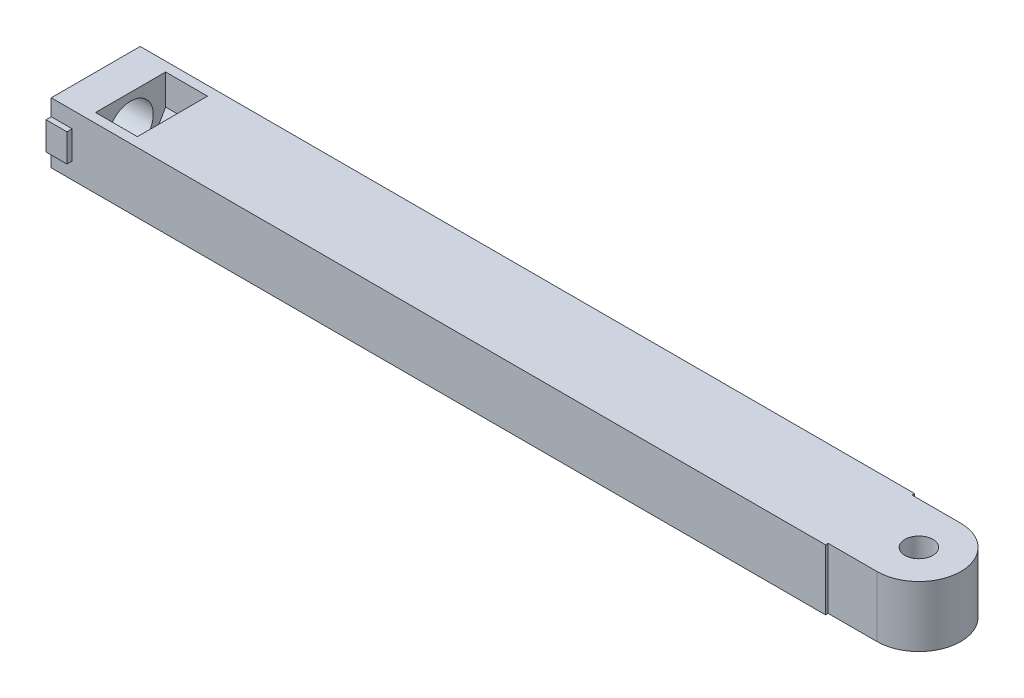
ISO-10303-21;
HEADER;
FILE_DESCRIPTION(('STEP AP214'),'2;1');
FILE_NAME('part.step','',(''),(''),'','','');
FILE_SCHEMA(('AUTOMOTIVE_DESIGN { 1 0 10303 214 1 1 1 1 }'));
ENDSEC;
DATA;
#1=APPLICATION_CONTEXT('core data for automotive mechanical design processes');
#2=APPLICATION_PROTOCOL_DEFINITION('international standard','automotive_design',2000,#1);
#3=PRODUCT_CONTEXT('',#1,'mechanical');
#4=PRODUCT('Part','Part','',(#3));
#5=PRODUCT_RELATED_PRODUCT_CATEGORY('part','',(#4));
#6=PRODUCT_DEFINITION_FORMATION('','',#4);
#7=PRODUCT_DEFINITION_CONTEXT('part definition',#1,'design');
#8=PRODUCT_DEFINITION('design','',#6,#7);
#9=PRODUCT_DEFINITION_SHAPE('','',#8);
#10=(LENGTH_UNIT() NAMED_UNIT(*) SI_UNIT(.MILLI.,.METRE.));
#11=(NAMED_UNIT(*) PLANE_ANGLE_UNIT() SI_UNIT($,.RADIAN.));
#12=(NAMED_UNIT(*) SI_UNIT($,.STERADIAN.) SOLID_ANGLE_UNIT());
#13=UNCERTAINTY_MEASURE_WITH_UNIT(LENGTH_MEASURE(1.E-05),#10,'distance_accuracy_value','');
#14=(GEOMETRIC_REPRESENTATION_CONTEXT(3) GLOBAL_UNCERTAINTY_ASSIGNED_CONTEXT((#13)) GLOBAL_UNIT_ASSIGNED_CONTEXT((#10,
#11,#12)) REPRESENTATION_CONTEXT('',''));
#15=CARTESIAN_POINT('',(0.,0.,0.));
#16=DIRECTION('',(0.,0.,1.));
#17=DIRECTION('',(1.,0.,0.));
#18=AXIS2_PLACEMENT_3D('',#15,#16,#17);
#19=CARTESIAN_POINT('',(-118.,-4.35,6.37500000000001));
#20=DIRECTION('',(0.,0.,-1.));
#21=DIRECTION('',(-1.,0.,0.));
#22=AXIS2_PLACEMENT_3D('',#19,#20,#21);
#23=PLANE('',#22);
#24=DIRECTION('',(-1.,0.,0.));
#25=VECTOR('',#24,1.);
#26=CARTESIAN_POINT('',(-115.,2.,6.37500000000002));
#27=LINE('',#26,#25);
#28=CARTESIAN_POINT('',(-115.,2.,6.37500000000002));
#29=VERTEX_POINT('',#28);
#30=CARTESIAN_POINT('',(-118.,2.,6.37500000000002));
#31=VERTEX_POINT('',#30);
#32=EDGE_CURVE('E203',#29,#31,#27,.T.);
#33=ORIENTED_EDGE('',*,*,#32,.F.);
#34=DIRECTION('',(0.,-1.,0.));
#35=VECTOR('',#34,1.);
#36=CARTESIAN_POINT('',(-115.,2.,6.37500000000002));
#37=LINE('',#36,#35);
#38=CARTESIAN_POINT('',(-115.,-2.,6.37500000000002));
#39=VERTEX_POINT('',#38);
#40=EDGE_CURVE('E196',#29,#39,#37,.T.);
#41=ORIENTED_EDGE('',*,*,#40,.T.);
#42=DIRECTION('',(-1.,0.,0.));
#43=VECTOR('',#42,1.);
#44=CARTESIAN_POINT('',(-115.,-2.,6.37500000000002));
#45=LINE('',#44,#43);
#46=CARTESIAN_POINT('',(-118.,-2.,6.37500000000001));
#47=VERTEX_POINT('',#46);
#48=EDGE_CURVE('E182',#39,#47,#45,.T.);
#49=ORIENTED_EDGE('',*,*,#48,.T.);
#50=DIRECTION('',(0.,1.,0.));
#51=VECTOR('',#50,1.);
#52=CARTESIAN_POINT('',(-118.,0.817855368675086,6.37500000000001));
#53=LINE('',#52,#51);
#54=CARTESIAN_POINT('',(-118.,-4.35,6.37500000000001));
#55=VERTEX_POINT('',#54);
#56=EDGE_CURVE('E291',#55,#47,#53,.T.);
#57=ORIENTED_EDGE('',*,*,#56,.F.);
#58=DIRECTION('',(1.,0.,0.));
#59=VECTOR('',#58,1.);
#60=CARTESIAN_POINT('',(-118.,-4.35,6.37500000000001));
#61=LINE('',#60,#59);
#62=CARTESIAN_POINT('',(-7.,-4.35,6.375));
#63=VERTEX_POINT('',#62);
#64=EDGE_CURVE('E303',#55,#63,#61,.T.);
#65=ORIENTED_EDGE('',*,*,#64,.T.);
#66=DIRECTION('',(0.,1.,0.));
#67=VECTOR('',#66,1.);
#68=CARTESIAN_POINT('',(-7.,-4.35,6.375));
#69=LINE('',#68,#67);
#70=CARTESIAN_POINT('',(-7.,4.35,6.375));
#71=VERTEX_POINT('',#70);
#72=EDGE_CURVE('E313',#63,#71,#69,.T.);
#73=ORIENTED_EDGE('',*,*,#72,.T.);
#74=DIRECTION('',(1.,0.,0.));
#75=VECTOR('',#74,1.);
#76=CARTESIAN_POINT('',(-118.,4.35,6.37500000000001));
#77=LINE('',#76,#75);
#78=CARTESIAN_POINT('',(-118.,4.35,6.37500000000001));
#79=VERTEX_POINT('',#78);
#80=EDGE_CURVE('E323',#79,#71,#77,.T.);
#81=ORIENTED_EDGE('',*,*,#80,.F.);
#82=EDGE_CURVE('E294',#31,#79,#53,.T.);
#83=ORIENTED_EDGE('',*,*,#82,.F.);
#84=EDGE_LOOP('',(#33,#41,#49,#57,#65,#73,#81,#83));
#85=FACE_BOUND('',#84,.T.);
#86=ADVANCED_FACE('F35',(#85),#23,.F.);
#87=CARTESIAN_POINT('',(-118.,-4.35,-6.37499999999999));
#88=DIRECTION('',(0.,0.,1.));
#89=DIRECTION('',(1.,0.,0.));
#90=AXIS2_PLACEMENT_3D('',#87,#88,#89);
#91=PLANE('',#90);
#92=DIRECTION('',(-1.,0.,0.));
#93=VECTOR('',#92,1.);
#94=CARTESIAN_POINT('',(-115.,-2.,-6.37499999999999));
#95=LINE('',#94,#93);
#96=CARTESIAN_POINT('',(-115.,-2.,-6.37499999999999));
#97=VERTEX_POINT('',#96);
#98=CARTESIAN_POINT('',(-118.,-2.,-6.37499999999999));
#99=VERTEX_POINT('',#98);
#100=EDGE_CURVE('E239',#97,#99,#95,.T.);
#101=ORIENTED_EDGE('',*,*,#100,.F.);
#102=DIRECTION('',(0.,1.,0.));
#103=VECTOR('',#102,1.);
#104=CARTESIAN_POINT('',(-115.,2.,-6.37499999999999));
#105=LINE('',#104,#103);
#106=CARTESIAN_POINT('',(-115.,2.,-6.37499999999999));
#107=VERTEX_POINT('',#106);
#108=EDGE_CURVE('E219',#97,#107,#105,.T.);
#109=ORIENTED_EDGE('',*,*,#108,.T.);
#110=DIRECTION('',(-1.,0.,0.));
#111=VECTOR('',#110,1.);
#112=CARTESIAN_POINT('',(-115.,2.,-6.37499999999999));
#113=LINE('',#112,#111);
#114=CARTESIAN_POINT('',(-118.,2.,-6.37499999999999));
#115=VERTEX_POINT('',#114);
#116=EDGE_CURVE('E232',#107,#115,#113,.T.);
#117=ORIENTED_EDGE('',*,*,#116,.T.);
#118=DIRECTION('',(0.,-1.,0.));
#119=VECTOR('',#118,1.);
#120=CARTESIAN_POINT('',(-118.,-0.75,-6.37499999999999));
#121=LINE('',#120,#119);
#122=CARTESIAN_POINT('',(-118.,4.35,-6.37499999999999));
#123=VERTEX_POINT('',#122);
#124=EDGE_CURVE('E297',#123,#115,#121,.T.);
#125=ORIENTED_EDGE('',*,*,#124,.F.);
#126=DIRECTION('',(1.,0.,0.));
#127=VECTOR('',#126,1.);
#128=CARTESIAN_POINT('',(-118.,4.35,-6.37499999999999));
#129=LINE('',#128,#127);
#130=CARTESIAN_POINT('',(-7.,4.35,-6.375));
#131=VERTEX_POINT('',#130);
#132=EDGE_CURVE('E320',#123,#131,#129,.T.);
#133=ORIENTED_EDGE('',*,*,#132,.T.);
#134=DIRECTION('',(0.,-1.,0.));
#135=VECTOR('',#134,1.);
#136=CARTESIAN_POINT('',(-7.,-4.35,-6.375));
#137=LINE('',#136,#135);
#138=CARTESIAN_POINT('',(-7.,-4.35,-6.375));
#139=VERTEX_POINT('',#138);
#140=EDGE_CURVE('E307',#131,#139,#137,.T.);
#141=ORIENTED_EDGE('',*,*,#140,.T.);
#142=DIRECTION('',(1.,0.,0.));
#143=VECTOR('',#142,1.);
#144=CARTESIAN_POINT('',(-118.,-4.35,-6.37499999999999));
#145=LINE('',#144,#143);
#146=CARTESIAN_POINT('',(-118.,-4.35,-6.37499999999999));
#147=VERTEX_POINT('',#146);
#148=EDGE_CURVE('E317',#147,#139,#145,.T.);
#149=ORIENTED_EDGE('',*,*,#148,.F.);
#150=EDGE_CURVE('E296',#99,#147,#121,.T.);
#151=ORIENTED_EDGE('',*,*,#150,.F.);
#152=EDGE_LOOP('',(#101,#109,#117,#125,#133,#141,#149,#151));
#153=FACE_BOUND('',#152,.T.);
#154=ADVANCED_FACE('F415',(#153),#91,.F.);
#155=CARTESIAN_POINT('',(-4.99999999999992,0.,0.));
#156=DIRECTION('',(-1.,0.,0.));
#157=DIRECTION('',(0.,0.,1.));
#158=AXIS2_PLACEMENT_3D('',#155,#156,#157);
#159=CYLINDRICAL_SURFACE('',#158,3.25);
#160=CARTESIAN_POINT('',(-118.,0.,0.));
#161=DIRECTION('',(-1.,0.,0.));
#162=DIRECTION('',(0.,0.,1.));
#163=AXIS2_PLACEMENT_3D('',#160,#161,#162);
#164=CIRCLE('',#163,3.25);
#165=CARTESIAN_POINT('',(-118.,0.,3.25000000000002));
#166=VERTEX_POINT('',#165);
#167=EDGE_CURVE('E284',#166,#166,#164,.T.);
#168=CARTESIAN_POINT('',(-113.,0.,0.));
#169=DIRECTION('',(1.,0.,0.));
#170=DIRECTION('',(0.,0.,-1.));
#171=AXIS2_PLACEMENT_3D('',#168,#169,#170);
#172=CIRCLE('',#171,3.25);
#173=CARTESIAN_POINT('',(-113.,0.,3.25000000000002));
#174=VERTEX_POINT('',#173);
#175=EDGE_CURVE('E270',#174,#174,#172,.F.);
#176=CARTESIAN_POINT('',(-118.,0.,3.25000000000002));
#177=CARTESIAN_POINT('',(-117.947916666667,0.,3.25000000000002));
#178=CARTESIAN_POINT('',(-117.895833333333,0.,3.25000000000002));
#179=CARTESIAN_POINT('',(-117.791666666667,0.,3.25000000000002));
#180=CARTESIAN_POINT('',(-117.739583333333,0.,3.25000000000002));
#181=CARTESIAN_POINT('',(-117.635416666667,0.,3.25000000000002));
#182=CARTESIAN_POINT('',(-117.583333333333,0.,3.25000000000002));
#183=CARTESIAN_POINT('',(-117.479166666667,0.,3.25000000000002));
#184=CARTESIAN_POINT('',(-117.427083333333,0.,3.25000000000002));
#185=CARTESIAN_POINT('',(-117.322916666667,0.,3.25000000000002));
#186=CARTESIAN_POINT('',(-117.270833333333,0.,3.25000000000002));
#187=CARTESIAN_POINT('',(-117.166666666667,0.,3.25000000000002));
#188=CARTESIAN_POINT('',(-117.114583333333,0.,3.25000000000002));
#189=CARTESIAN_POINT('',(-117.010416666667,0.,3.25000000000002));
#190=CARTESIAN_POINT('',(-116.958333333333,0.,3.25000000000002));
#191=CARTESIAN_POINT('',(-116.854166666667,0.,3.25000000000002));
#192=CARTESIAN_POINT('',(-116.802083333333,0.,3.25000000000002));
#193=CARTESIAN_POINT('',(-116.697916666667,0.,3.25000000000002));
#194=CARTESIAN_POINT('',(-116.645833333333,0.,3.25000000000002));
#195=CARTESIAN_POINT('',(-116.541666666667,0.,3.25000000000002));
#196=CARTESIAN_POINT('',(-116.489583333333,0.,3.25000000000002));
#197=CARTESIAN_POINT('',(-116.385416666667,0.,3.25000000000002));
#198=CARTESIAN_POINT('',(-116.333333333333,0.,3.25000000000002));
#199=CARTESIAN_POINT('',(-116.229166666667,0.,3.25000000000002));
#200=CARTESIAN_POINT('',(-116.177083333333,0.,3.25000000000002));
#201=CARTESIAN_POINT('',(-116.072916666667,0.,3.25000000000002));
#202=CARTESIAN_POINT('',(-116.020833333333,0.,3.25000000000002));
#203=CARTESIAN_POINT('',(-115.916666666667,0.,3.25000000000002));
#204=CARTESIAN_POINT('',(-115.864583333333,0.,3.25000000000002));
#205=CARTESIAN_POINT('',(-115.760416666667,0.,3.25000000000002));
#206=CARTESIAN_POINT('',(-115.708333333333,0.,3.25000000000002));
#207=CARTESIAN_POINT('',(-115.604166666667,0.,3.25000000000002));
#208=CARTESIAN_POINT('',(-115.552083333333,0.,3.25000000000002));
#209=CARTESIAN_POINT('',(-115.447916666667,0.,3.25000000000002));
#210=CARTESIAN_POINT('',(-115.395833333333,0.,3.25000000000002));
#211=CARTESIAN_POINT('',(-115.291666666667,0.,3.25000000000002));
#212=CARTESIAN_POINT('',(-115.239583333333,0.,3.25000000000002));
#213=CARTESIAN_POINT('',(-115.135416666667,0.,3.25000000000002));
#214=CARTESIAN_POINT('',(-115.083333333333,0.,3.25000000000002));
#215=CARTESIAN_POINT('',(-114.979166666667,0.,3.25000000000002));
#216=CARTESIAN_POINT('',(-114.927083333333,0.,3.25000000000002));
#217=CARTESIAN_POINT('',(-114.822916666667,0.,3.25000000000002));
#218=CARTESIAN_POINT('',(-114.770833333333,0.,3.25000000000002));
#219=CARTESIAN_POINT('',(-114.666666666667,0.,3.25000000000002));
#220=CARTESIAN_POINT('',(-114.614583333333,0.,3.25000000000002));
#221=CARTESIAN_POINT('',(-114.510416666667,0.,3.25000000000002));
#222=CARTESIAN_POINT('',(-114.458333333333,0.,3.25000000000002));
#223=CARTESIAN_POINT('',(-114.354166666667,0.,3.25000000000002));
#224=CARTESIAN_POINT('',(-114.302083333333,0.,3.25000000000002));
#225=CARTESIAN_POINT('',(-114.197916666667,0.,3.25000000000002));
#226=CARTESIAN_POINT('',(-114.145833333333,0.,3.25000000000002));
#227=CARTESIAN_POINT('',(-114.041666666667,0.,3.25000000000002));
#228=CARTESIAN_POINT('',(-113.989583333333,0.,3.25000000000002));
#229=CARTESIAN_POINT('',(-113.885416666667,0.,3.25000000000002));
#230=CARTESIAN_POINT('',(-113.833333333333,0.,3.25000000000002));
#231=CARTESIAN_POINT('',(-113.729166666667,0.,3.25000000000002));
#232=CARTESIAN_POINT('',(-113.677083333333,0.,3.25000000000002));
#233=CARTESIAN_POINT('',(-113.572916666667,0.,3.25000000000002));
#234=CARTESIAN_POINT('',(-113.520833333333,0.,3.25000000000002));
#235=CARTESIAN_POINT('',(-113.416666666667,0.,3.25000000000002));
#236=CARTESIAN_POINT('',(-113.364583333333,0.,3.25000000000002));
#237=CARTESIAN_POINT('',(-113.260416666667,0.,3.25000000000002));
#238=CARTESIAN_POINT('',(-113.208333333333,0.,3.25000000000002));
#239=CARTESIAN_POINT('',(-113.104166666667,0.,3.25000000000002));
#240=CARTESIAN_POINT('',(-113.052083333333,0.,3.25000000000002));
#241=CARTESIAN_POINT('',(-113.,0.,3.25000000000002));
#242=B_SPLINE_CURVE_WITH_KNOTS('',3,(#176,#177,#178,#179,#180,#181,#182,#183,#184,#185,#186,
#187,#188,#189,#190,#191,#192,#193,#194,#195,#196,#197,#198,#199,#200,#201,#202,#203,#204,#205,
#206,#207,#208,#209,#210,#211,#212,#213,#214,#215,#216,#217,#218,#219,#220,#221,#222,#223,#224,
#225,#226,#227,#228,#229,#230,#231,#232,#233,#234,#235,#236,#237,#238,#239,#240,#241),
.UNSPECIFIED.,.F.,.F.,(4,2,2,2,2,2,2,2,2,2,2,2,2,2,2,2,2,2,2,2,2,2,2,2,2,2,2,2,2,2,2,2,4),(0.,
0.156249999999997,0.312499999999993,0.468750000000004,0.625000000000001,0.781249999999997,
0.937500000000008,1.09375,1.25,1.40625,1.56249999999999,1.71875,1.875,2.03125,2.18750000000001,
2.34375000000001,2.5,2.65625,2.8125,2.96875000000001,3.125,3.28125,3.43750000000001,
3.59375000000001,3.75,3.90625,4.0625,4.21875000000001,4.375,4.53125,4.68750000000001,
4.84375000000001,5.),.UNSPECIFIED.);
#243=EDGE_CURVE('BSEAM420',#166,#174,#242,.T.);
#244=ORIENTED_EDGE('',*,*,#167,.T.);
#245=ORIENTED_EDGE('',*,*,#175,.F.);
#246=ORIENTED_EDGE('',*,*,#243,.T.);
#247=ORIENTED_EDGE('',*,*,#243,.F.);
#248=EDGE_LOOP('',(#244,#246,#245,#247));
#249=FACE_BOUND('',#248,.T.);
#250=ADVANCED_FACE('F420',(#249),#159,.F.);
#251=CARTESIAN_POINT('',(0.,-4.35,0.));
#252=DIRECTION('',(0.,1.,0.));
#253=DIRECTION('',(0.,0.,1.));
#254=AXIS2_PLACEMENT_3D('',#251,#252,#253);
#255=CYLINDRICAL_SURFACE('',#254,6.);
#256=DIRECTION('',(0.,1.,0.));
#257=VECTOR('',#256,1.);
#258=CARTESIAN_POINT('',(0.,-4.35,-6.));
#259=LINE('',#258,#257);
#260=CARTESIAN_POINT('',(0.,-4.35,-6.));
#261=VERTEX_POINT('',#260);
#262=CARTESIAN_POINT('',(0.,4.35,-6.));
#263=VERTEX_POINT('',#262);
#264=EDGE_CURVE('E350',#261,#263,#259,.T.);
#265=ORIENTED_EDGE('',*,*,#264,.T.);
#266=CARTESIAN_POINT('',(0.,4.35,0.));
#267=DIRECTION('',(0.,1.,0.));
#268=DIRECTION('',(0.,0.,-1.));
#269=AXIS2_PLACEMENT_3D('',#266,#267,#268);
#270=CIRCLE('',#269,6.);
#271=CARTESIAN_POINT('',(0.,4.35,6.));
#272=VERTEX_POINT('',#271);
#273=EDGE_CURVE('E329',#272,#263,#270,.T.);
#274=ORIENTED_EDGE('',*,*,#273,.F.);
#275=DIRECTION('',(0.,1.,0.));
#276=VECTOR('',#275,1.);
#277=CARTESIAN_POINT('',(0.,-4.35,6.));
#278=LINE('',#277,#276);
#279=CARTESIAN_POINT('',(0.,-4.35,6.));
#280=VERTEX_POINT('',#279);
#281=EDGE_CURVE('E351',#280,#272,#278,.T.);
#282=ORIENTED_EDGE('',*,*,#281,.F.);
#283=CARTESIAN_POINT('',(0.,-4.35,0.));
#284=DIRECTION('',(0.,1.,0.));
#285=DIRECTION('',(0.,0.,-1.));
#286=AXIS2_PLACEMENT_3D('',#283,#284,#285);
#287=CIRCLE('',#286,6.);
#288=EDGE_CURVE('E341',#280,#261,#287,.T.);
#289=ORIENTED_EDGE('',*,*,#288,.T.);
#290=EDGE_LOOP('',(#265,#274,#282,#289));
#291=FACE_BOUND('',#290,.T.);
#292=ADVANCED_FACE('F37',(#291),#255,.T.);
#293=CARTESIAN_POINT('',(-7.,-4.35,6.));
#294=DIRECTION('',(0.,0.,1.));
#295=DIRECTION('',(1.,0.,0.));
#296=AXIS2_PLACEMENT_3D('',#293,#294,#295);
#297=PLANE('',#296);
#298=ORIENTED_EDGE('',*,*,#281,.T.);
#299=DIRECTION('',(1.,0.,0.));
#300=VECTOR('',#299,1.);
#301=CARTESIAN_POINT('',(-7.,4.35,6.));
#302=LINE('',#301,#300);
#303=CARTESIAN_POINT('',(-7.,4.35,6.));
#304=VERTEX_POINT('',#303);
#305=EDGE_CURVE('E335',#304,#272,#302,.T.);
#306=ORIENTED_EDGE('',*,*,#305,.F.);
#307=DIRECTION('',(0.,1.,0.));
#308=VECTOR('',#307,1.);
#309=CARTESIAN_POINT('',(-7.,-4.35,6.));
#310=LINE('',#309,#308);
#311=CARTESIAN_POINT('',(-7.,-4.35,6.));
#312=VERTEX_POINT('',#311);
#313=EDGE_CURVE('E354',#312,#304,#310,.T.);
#314=ORIENTED_EDGE('',*,*,#313,.F.);
#315=DIRECTION('',(1.,0.,0.));
#316=VECTOR('',#315,1.);
#317=CARTESIAN_POINT('',(-7.,-4.35,6.));
#318=LINE('',#317,#316);
#319=EDGE_CURVE('E347',#312,#280,#318,.T.);
#320=ORIENTED_EDGE('',*,*,#319,.T.);
#321=EDGE_LOOP('',(#298,#306,#314,#320));
#322=FACE_BOUND('',#321,.T.);
#323=ADVANCED_FACE('F434',(#322),#297,.T.);
#324=CARTESIAN_POINT('',(0.,-4.35,-6.));
#325=DIRECTION('',(0.,0.,-1.));
#326=DIRECTION('',(-1.,0.,0.));
#327=AXIS2_PLACEMENT_3D('',#324,#325,#326);
#328=PLANE('',#327);
#329=DIRECTION('',(0.,1.,0.));
#330=VECTOR('',#329,1.);
#331=CARTESIAN_POINT('',(-7.,-4.35,-6.));
#332=LINE('',#331,#330);
#333=CARTESIAN_POINT('',(-7.,-4.35,-6.));
#334=VERTEX_POINT('',#333);
#335=CARTESIAN_POINT('',(-7.,4.35,-6.));
#336=VERTEX_POINT('',#335);
#337=EDGE_CURVE('E356',#334,#336,#332,.T.);
#338=ORIENTED_EDGE('',*,*,#337,.T.);
#339=DIRECTION('',(-1.,0.,0.));
#340=VECTOR('',#339,1.);
#341=CARTESIAN_POINT('',(0.,4.35,-6.));
#342=LINE('',#341,#340);
#343=EDGE_CURVE('E332',#263,#336,#342,.T.);
#344=ORIENTED_EDGE('',*,*,#343,.F.);
#345=ORIENTED_EDGE('',*,*,#264,.F.);
#346=DIRECTION('',(-1.,0.,0.));
#347=VECTOR('',#346,1.);
#348=CARTESIAN_POINT('',(0.,-4.35,-6.));
#349=LINE('',#348,#347);
#350=EDGE_CURVE('E344',#261,#334,#349,.T.);
#351=ORIENTED_EDGE('',*,*,#350,.T.);
#352=EDGE_LOOP('',(#338,#344,#345,#351));
#353=FACE_BOUND('',#352,.T.);
#354=ADVANCED_FACE('F433',(#353),#328,.T.);
#355=CARTESIAN_POINT('',(0.,-4.35,0.));
#356=DIRECTION('',(0.,-1.,0.));
#357=DIRECTION('',(0.,0.,-1.));
#358=AXIS2_PLACEMENT_3D('',#355,#356,#357);
#359=PLANE('',#358);
#360=DIRECTION('',(0.,0.,1.));
#361=VECTOR('',#360,1.);
#362=CARTESIAN_POINT('',(-107.,-4.35,0.));
#363=LINE('',#362,#361);
#364=CARTESIAN_POINT('',(-107.,-4.35,-2.51352632902511));
#365=VERTEX_POINT('',#364);
#366=CARTESIAN_POINT('',(-107.,-4.35,2.51352632902514));
#367=VERTEX_POINT('',#366);
#368=EDGE_CURVE('E282',#365,#367,#363,.T.);
#369=ORIENTED_EDGE('',*,*,#368,.F.);
#370=DIRECTION('',(1.,0.,0.));
#371=VECTOR('',#370,1.);
#372=CARTESIAN_POINT('',(0.,-4.35,-2.51352632902513));
#373=LINE('',#372,#371);
#374=CARTESIAN_POINT('',(-113.,-4.35,-2.51352632902511));
#375=VERTEX_POINT('',#374);
#376=EDGE_CURVE('E43',#375,#365,#373,.T.);
#377=ORIENTED_EDGE('',*,*,#376,.F.);
#378=DIRECTION('',(0.,0.,1.));
#379=VECTOR('',#378,1.);
#380=CARTESIAN_POINT('',(-113.,-4.35,0.));
#381=LINE('',#380,#379);
#382=CARTESIAN_POINT('',(-113.,-4.35,2.51352632902514));
#383=VERTEX_POINT('',#382);
#384=EDGE_CURVE('E275',#375,#383,#381,.T.);
#385=ORIENTED_EDGE('',*,*,#384,.T.);
#386=DIRECTION('',(-1.,0.,0.));
#387=VECTOR('',#386,1.);
#388=CARTESIAN_POINT('',(0.,-4.35,2.51352632902513));
#389=LINE('',#388,#387);
#390=EDGE_CURVE('E11',#367,#383,#389,.T.);
#391=ORIENTED_EDGE('',*,*,#390,.F.);
#392=EDGE_LOOP('',(#369,#377,#385,#391));
#393=FACE_BOUND('',#392,.T.);
#394=CARTESIAN_POINT('',(0.,-4.35,0.));
#395=DIRECTION('',(0.,1.,0.));
#396=DIRECTION('',(0.,0.,1.));
#397=AXIS2_PLACEMENT_3D('',#394,#395,#396);
#398=CIRCLE('',#397,2.);
#399=CARTESIAN_POINT('',(0.,-4.35,2.));
#400=VERTEX_POINT('',#399);
#401=EDGE_CURVE('E338',#400,#400,#398,.T.);
#402=ORIENTED_EDGE('',*,*,#401,.T.);
#403=EDGE_LOOP('',(#402));
#404=FACE_BOUND('',#403,.T.);
#405=ORIENTED_EDGE('',*,*,#288,.F.);
#406=ORIENTED_EDGE('',*,*,#319,.F.);
#407=DIRECTION('',(0.,0.,1.));
#408=VECTOR('',#407,1.);
#409=CARTESIAN_POINT('',(-7.,-4.35,-6.375));
#410=LINE('',#409,#408);
#411=EDGE_CURVE('E309',#312,#63,#410,.T.);
#412=ORIENTED_EDGE('',*,*,#411,.T.);
#413=ORIENTED_EDGE('',*,*,#64,.F.);
#414=DIRECTION('',(0.,0.,1.));
#415=VECTOR('',#414,1.);
#416=CARTESIAN_POINT('',(-118.,-4.35,-6.37499999999999));
#417=LINE('',#416,#415);
#418=EDGE_CURVE('E300',#147,#55,#417,.T.);
#419=ORIENTED_EDGE('',*,*,#418,.F.);
#420=ORIENTED_EDGE('',*,*,#148,.T.);
#421=EDGE_CURVE('E310',#139,#334,#410,.T.);
#422=ORIENTED_EDGE('',*,*,#421,.T.);
#423=ORIENTED_EDGE('',*,*,#350,.F.);
#424=EDGE_LOOP('',(#405,#406,#412,#413,#419,#420,#422,#423));
#425=FACE_BOUND('',#424,.T.);
#426=ADVANCED_FACE('F382',(#393,#404,#425),#359,.T.);
#427=CARTESIAN_POINT('',(0.,-4.35,0.));
#428=DIRECTION('',(0.,1.,0.));
#429=DIRECTION('',(0.,0.,1.));
#430=AXIS2_PLACEMENT_3D('',#427,#428,#429);
#431=CYLINDRICAL_SURFACE('',#430,2.);
#432=ORIENTED_EDGE('',*,*,#401,.F.);
#433=EDGE_LOOP('',(#432));
#434=FACE_BOUND('',#433,.T.);
#435=CARTESIAN_POINT('',(0.,4.35,0.));
#436=DIRECTION('',(0.,1.,0.));
#437=DIRECTION('',(0.,0.,1.));
#438=AXIS2_PLACEMENT_3D('',#435,#436,#437);
#439=CIRCLE('',#438,2.);
#440=CARTESIAN_POINT('',(0.,4.35,2.));
#441=VERTEX_POINT('',#440);
#442=EDGE_CURVE('E326',#441,#441,#439,.T.);
#443=ORIENTED_EDGE('',*,*,#442,.T.);
#444=EDGE_LOOP('',(#443));
#445=FACE_BOUND('',#444,.T.);
#446=ADVANCED_FACE('F427',(#434,#445),#431,.F.);
#447=CARTESIAN_POINT('',(0.,4.35,0.));
#448=DIRECTION('',(0.,-1.,0.));
#449=DIRECTION('',(0.,0.,-1.));
#450=AXIS2_PLACEMENT_3D('',#447,#448,#449);
#451=PLANE('',#450);
#452=DIRECTION('',(1.,0.,0.));
#453=VECTOR('',#452,1.);
#454=CARTESIAN_POINT('',(0.,4.35,-5.025));
#455=LINE('',#454,#453);
#456=CARTESIAN_POINT('',(-113.,4.35,-5.02499999999998));
#457=VERTEX_POINT('',#456);
#458=CARTESIAN_POINT('',(-107.,4.35,-5.02499999999999));
#459=VERTEX_POINT('',#458);
#460=EDGE_CURVE('E353',#457,#459,#455,.T.);
#461=ORIENTED_EDGE('',*,*,#460,.T.);
#462=DIRECTION('',(0.,0.,1.));
#463=VECTOR('',#462,1.);
#464=CARTESIAN_POINT('',(-107.,4.35,0.));
#465=LINE('',#464,#463);
#466=CARTESIAN_POINT('',(-107.,4.35,5.02500000000001));
#467=VERTEX_POINT('',#466);
#468=EDGE_CURVE('E279',#459,#467,#465,.T.);
#469=ORIENTED_EDGE('',*,*,#468,.T.);
#470=DIRECTION('',(-1.,0.,0.));
#471=VECTOR('',#470,1.);
#472=CARTESIAN_POINT('',(0.,4.35,5.025));
#473=LINE('',#472,#471);
#474=CARTESIAN_POINT('',(-113.,4.35,5.02500000000001));
#475=VERTEX_POINT('',#474);
#476=EDGE_CURVE('E366',#467,#475,#473,.T.);
#477=ORIENTED_EDGE('',*,*,#476,.T.);
#478=DIRECTION('',(0.,0.,1.));
#479=VECTOR('',#478,1.);
#480=CARTESIAN_POINT('',(-113.,4.35,0.));
#481=LINE('',#480,#479);
#482=EDGE_CURVE('E273',#457,#475,#481,.T.);
#483=ORIENTED_EDGE('',*,*,#482,.F.);
#484=EDGE_LOOP('',(#461,#469,#477,#483));
#485=FACE_BOUND('',#484,.T.);
#486=ORIENTED_EDGE('',*,*,#273,.T.);
#487=ORIENTED_EDGE('',*,*,#343,.T.);
#488=DIRECTION('',(0.,0.,-1.));
#489=VECTOR('',#488,1.);
#490=CARTESIAN_POINT('',(-7.,4.35,-6.375));
#491=LINE('',#490,#489);
#492=EDGE_CURVE('E288',#336,#131,#491,.T.);
#493=ORIENTED_EDGE('',*,*,#492,.T.);
#494=ORIENTED_EDGE('',*,*,#132,.F.);
#495=DIRECTION('',(0.,0.,-1.));
#496=VECTOR('',#495,1.);
#497=CARTESIAN_POINT('',(-118.,4.35,-6.37499999999999));
#498=LINE('',#497,#496);
#499=EDGE_CURVE('E293',#79,#123,#498,.T.);
#500=ORIENTED_EDGE('',*,*,#499,.F.);
#501=ORIENTED_EDGE('',*,*,#80,.T.);
#502=EDGE_CURVE('E304',#71,#304,#491,.T.);
#503=ORIENTED_EDGE('',*,*,#502,.T.);
#504=ORIENTED_EDGE('',*,*,#305,.T.);
#505=EDGE_LOOP('',(#486,#487,#493,#494,#500,#501,#503,#504));
#506=FACE_BOUND('',#505,.T.);
#507=ORIENTED_EDGE('',*,*,#442,.F.);
#508=EDGE_LOOP('',(#507));
#509=FACE_BOUND('',#508,.T.);
#510=ADVANCED_FACE('F390',(#485,#506,#509),#451,.F.);
#511=CARTESIAN_POINT('',(-7.,0.,0.));
#512=DIRECTION('',(1.,0.,0.));
#513=DIRECTION('',(0.,0.,-1.));
#514=AXIS2_PLACEMENT_3D('',#511,#512,#513);
#515=PLANE('',#514);
#516=ORIENTED_EDGE('',*,*,#337,.F.);
#517=ORIENTED_EDGE('',*,*,#421,.F.);
#518=ORIENTED_EDGE('',*,*,#140,.F.);
#519=ORIENTED_EDGE('',*,*,#492,.F.);
#520=EDGE_LOOP('',(#516,#517,#518,#519));
#521=FACE_BOUND('',#520,.T.);
#522=ADVANCED_FACE('F411',(#521),#515,.T.);
#523=CARTESIAN_POINT('',(-118.,0.,0.));
#524=DIRECTION('',(1.,0.,0.));
#525=DIRECTION('',(0.,0.,-1.));
#526=AXIS2_PLACEMENT_3D('',#523,#524,#525);
#527=PLANE('',#526);
#528=ORIENTED_EDGE('',*,*,#167,.F.);
#529=EDGE_LOOP('',(#528));
#530=FACE_BOUND('',#529,.T.);
#531=ORIENTED_EDGE('',*,*,#56,.T.);
#532=DIRECTION('',(0.,0.,1.));
#533=VECTOR('',#532,1.);
#534=CARTESIAN_POINT('',(-118.,-2.,6.37500000000002));
#535=LINE('',#534,#533);
#536=CARTESIAN_POINT('',(-118.,-2.,7.12500000000002));
#537=VERTEX_POINT('',#536);
#538=EDGE_CURVE('E50',#47,#537,#535,.T.);
#539=ORIENTED_EDGE('',*,*,#538,.T.);
#540=DIRECTION('',(0.,1.,0.));
#541=VECTOR('',#540,1.);
#542=CARTESIAN_POINT('',(-118.,2.,7.12500000000002));
#543=LINE('',#542,#541);
#544=CARTESIAN_POINT('',(-118.,2.,7.12500000000002));
#545=VERTEX_POINT('',#544);
#546=EDGE_CURVE('E207',#537,#545,#543,.T.);
#547=ORIENTED_EDGE('',*,*,#546,.T.);
#548=DIRECTION('',(0.,0.,-1.));
#549=VECTOR('',#548,1.);
#550=CARTESIAN_POINT('',(-118.,2.,6.37500000000002));
#551=LINE('',#550,#549);
#552=EDGE_CURVE('E204',#545,#31,#551,.T.);
#553=ORIENTED_EDGE('',*,*,#552,.T.);
#554=ORIENTED_EDGE('',*,*,#82,.T.);
#555=ORIENTED_EDGE('',*,*,#499,.T.);
#556=ORIENTED_EDGE('',*,*,#124,.T.);
#557=DIRECTION('',(0.,0.,-1.));
#558=VECTOR('',#557,1.);
#559=CARTESIAN_POINT('',(-118.,2.,-6.37499999999999));
#560=LINE('',#559,#558);
#561=CARTESIAN_POINT('',(-118.,2.,-7.12499999999999));
#562=VERTEX_POINT('',#561);
#563=EDGE_CURVE('E58',#115,#562,#560,.T.);
#564=ORIENTED_EDGE('',*,*,#563,.T.);
#565=DIRECTION('',(0.,-1.,0.));
#566=VECTOR('',#565,1.);
#567=CARTESIAN_POINT('',(-118.,2.,-7.12499999999999));
#568=LINE('',#567,#566);
#569=CARTESIAN_POINT('',(-118.,-2.,-7.12499999999998));
#570=VERTEX_POINT('',#569);
#571=EDGE_CURVE('E234',#562,#570,#568,.T.);
#572=ORIENTED_EDGE('',*,*,#571,.T.);
#573=DIRECTION('',(0.,0.,1.));
#574=VECTOR('',#573,1.);
#575=CARTESIAN_POINT('',(-118.,-2.,-6.37499999999999));
#576=LINE('',#575,#574);
#577=EDGE_CURVE('E223',#570,#99,#576,.T.);
#578=ORIENTED_EDGE('',*,*,#577,.T.);
#579=ORIENTED_EDGE('',*,*,#150,.T.);
#580=ORIENTED_EDGE('',*,*,#418,.T.);
#581=EDGE_LOOP('',(#531,#539,#547,#553,#554,#555,#556,#564,#572,#578,#579,#580));
#582=FACE_BOUND('',#581,.T.);
#583=ADVANCED_FACE('F408',(#530,#582),#527,.F.);
#584=ORIENTED_EDGE('',*,*,#411,.F.);
#585=ORIENTED_EDGE('',*,*,#313,.T.);
#586=ORIENTED_EDGE('',*,*,#502,.F.);
#587=ORIENTED_EDGE('',*,*,#72,.F.);
#588=EDGE_LOOP('',(#584,#585,#586,#587));
#589=FACE_BOUND('',#588,.T.);
#590=ADVANCED_FACE('F401',(#589),#515,.T.);
#591=CARTESIAN_POINT('',(-107.,4.35177765401681,5.02500000000001));
#592=DIRECTION('',(0.,0.,1.));
#593=DIRECTION('',(0.,-1.,0.));
#594=AXIS2_PLACEMENT_3D('',#591,#592,#593);
#595=PLANE('',#594);
#596=DIRECTION('',(0.,1.,0.));
#597=VECTOR('',#596,1.);
#598=CARTESIAN_POINT('',(-107.,4.35177765401681,5.02500000000001));
#599=LINE('',#598,#597);
#600=CARTESIAN_POINT('',(-107.,0.,5.02500000000001));
#601=VERTEX_POINT('',#600);
#602=EDGE_CURVE('E255',#601,#467,#599,.T.);
#603=ORIENTED_EDGE('',*,*,#602,.F.);
#604=DIRECTION('',(-1.,0.,0.));
#605=VECTOR('',#604,1.);
#606=CARTESIAN_POINT('',(-107.,0.,5.02500000000001));
#607=LINE('',#606,#605);
#608=CARTESIAN_POINT('',(-113.,0.,5.02500000000002));
#609=VERTEX_POINT('',#608);
#610=EDGE_CURVE('E267',#601,#609,#607,.T.);
#611=ORIENTED_EDGE('',*,*,#610,.T.);
#612=DIRECTION('',(0.,1.,0.));
#613=VECTOR('',#612,1.);
#614=CARTESIAN_POINT('',(-113.,4.35177765401681,5.02500000000001));
#615=LINE('',#614,#613);
#616=EDGE_CURVE('E250',#609,#475,#615,.T.);
#617=ORIENTED_EDGE('',*,*,#616,.T.);
#618=ORIENTED_EDGE('',*,*,#476,.F.);
#619=EDGE_LOOP('',(#603,#611,#617,#618));
#620=FACE_BOUND('',#619,.T.);
#621=ADVANCED_FACE('F399',(#620),#595,.F.);
#622=CARTESIAN_POINT('',(-107.,0.,-5.02499999999999));
#623=DIRECTION('',(0.,0.,-1.));
#624=DIRECTION('',(-1.,0.,0.));
#625=AXIS2_PLACEMENT_3D('',#622,#623,#624);
#626=PLANE('',#625);
#627=DIRECTION('',(0.,-1.,0.));
#628=VECTOR('',#627,1.);
#629=CARTESIAN_POINT('',(-113.,0.,-5.02499999999998));
#630=LINE('',#629,#628);
#631=CARTESIAN_POINT('',(-113.,0.,-5.02499999999998));
#632=VERTEX_POINT('',#631);
#633=EDGE_CURVE('E241',#457,#632,#630,.T.);
#634=ORIENTED_EDGE('',*,*,#633,.T.);
#635=DIRECTION('',(-1.,0.,0.));
#636=VECTOR('',#635,1.);
#637=CARTESIAN_POINT('',(-107.,0.,-5.02499999999999));
#638=LINE('',#637,#636);
#639=CARTESIAN_POINT('',(-107.,0.,-5.02499999999999));
#640=VERTEX_POINT('',#639);
#641=EDGE_CURVE('E258',#640,#632,#638,.T.);
#642=ORIENTED_EDGE('',*,*,#641,.F.);
#643=DIRECTION('',(0.,-1.,0.));
#644=VECTOR('',#643,1.);
#645=CARTESIAN_POINT('',(-107.,0.,-5.02499999999999));
#646=LINE('',#645,#644);
#647=EDGE_CURVE('E247',#459,#640,#646,.T.);
#648=ORIENTED_EDGE('',*,*,#647,.F.);
#649=ORIENTED_EDGE('',*,*,#460,.F.);
#650=EDGE_LOOP('',(#634,#642,#648,#649));
#651=FACE_BOUND('',#650,.T.);
#652=ADVANCED_FACE('F395',(#651),#626,.F.);
#653=CARTESIAN_POINT('',(-107.,0.,0.));
#654=DIRECTION('',(1.,0.,0.));
#655=DIRECTION('',(0.,0.,-1.));
#656=AXIS2_PLACEMENT_3D('',#653,#654,#655);
#657=PLANE('',#656);
#658=ORIENTED_EDGE('',*,*,#368,.T.);
#659=DIRECTION('',(0.,0.866025403784439,0.5));
#660=VECTOR('',#659,1.);
#661=CARTESIAN_POINT('',(-107.,-4.3517776540168,2.51250000000002));
#662=LINE('',#661,#660);
#663=EDGE_CURVE('E253',#367,#601,#662,.T.);
#664=ORIENTED_EDGE('',*,*,#663,.T.);
#665=ORIENTED_EDGE('',*,*,#602,.T.);
#666=ORIENTED_EDGE('',*,*,#468,.F.);
#667=ORIENTED_EDGE('',*,*,#647,.T.);
#668=DIRECTION('',(0.,-0.866025403784438,0.5));
#669=VECTOR('',#668,1.);
#670=CARTESIAN_POINT('',(-107.,0.,-5.02499999999999));
#671=LINE('',#670,#669);
#672=EDGE_CURVE('E249',#640,#365,#671,.T.);
#673=ORIENTED_EDGE('',*,*,#672,.T.);
#674=EDGE_LOOP('',(#658,#664,#665,#666,#667,#673));
#675=FACE_BOUND('',#674,.T.);
#676=CARTESIAN_POINT('',(-107.,0.,0.));
#677=DIRECTION('',(1.,0.,0.));
#678=DIRECTION('',(0.,0.,-1.));
#679=AXIS2_PLACEMENT_3D('',#676,#677,#678);
#680=CIRCLE('',#679,3.25);
#681=CARTESIAN_POINT('',(-107.,0.,3.25000000000001));
#682=VERTEX_POINT('',#681);
#683=EDGE_CURVE('E278',#682,#682,#680,.F.);
#684=ORIENTED_EDGE('',*,*,#683,.F.);
#685=EDGE_LOOP('',(#684));
#686=FACE_BOUND('',#685,.T.);
#687=ADVANCED_FACE('F376',(#675,#686),#657,.F.);
#688=CARTESIAN_POINT('',(-113.,0.,0.));
#689=DIRECTION('',(1.,0.,0.));
#690=DIRECTION('',(0.,0.,-1.));
#691=AXIS2_PLACEMENT_3D('',#688,#689,#690);
#692=PLANE('',#691);
#693=ORIENTED_EDGE('',*,*,#175,.T.);
#694=EDGE_LOOP('',(#693));
#695=FACE_BOUND('',#694,.T.);
#696=DIRECTION('',(0.,-0.866025403784438,0.5));
#697=VECTOR('',#696,1.);
#698=CARTESIAN_POINT('',(-113.,0.,-5.02499999999998));
#699=LINE('',#698,#697);
#700=EDGE_CURVE('E260',#632,#375,#699,.T.);
#701=ORIENTED_EDGE('',*,*,#700,.F.);
#702=ORIENTED_EDGE('',*,*,#633,.F.);
#703=ORIENTED_EDGE('',*,*,#482,.T.);
#704=ORIENTED_EDGE('',*,*,#616,.F.);
#705=DIRECTION('',(0.,0.866025403784439,0.5));
#706=VECTOR('',#705,1.);
#707=CARTESIAN_POINT('',(-113.,-4.3517776540168,2.51250000000002));
#708=LINE('',#707,#706);
#709=EDGE_CURVE('E263',#383,#609,#708,.T.);
#710=ORIENTED_EDGE('',*,*,#709,.F.);
#711=ORIENTED_EDGE('',*,*,#384,.F.);
#712=EDGE_LOOP('',(#701,#702,#703,#704,#710,#711));
#713=FACE_BOUND('',#712,.T.);
#714=ADVANCED_FACE('F397',(#695,#713),#692,.T.);
#715=CARTESIAN_POINT('',(-107.,-4.3517776540168,2.51250000000002));
#716=DIRECTION('',(0.,-0.5,0.866025403784439));
#717=DIRECTION('',(0.,-0.866025403784439,-0.5));
#718=AXIS2_PLACEMENT_3D('',#715,#716,#717);
#719=PLANE('',#718);
#720=ORIENTED_EDGE('',*,*,#390,.T.);
#721=ORIENTED_EDGE('',*,*,#709,.T.);
#722=ORIENTED_EDGE('',*,*,#610,.F.);
#723=ORIENTED_EDGE('',*,*,#663,.F.);
#724=EDGE_LOOP('',(#720,#721,#722,#723));
#725=FACE_BOUND('',#724,.T.);
#726=ADVANCED_FACE('F385',(#725),#719,.F.);
#727=CARTESIAN_POINT('',(-107.,0.,-5.02499999999999));
#728=DIRECTION('',(0.,-0.5,-0.866025403784439));
#729=DIRECTION('',(0.,0.866025403784439,-0.5));
#730=AXIS2_PLACEMENT_3D('',#727,#728,#729);
#731=PLANE('',#730);
#732=ORIENTED_EDGE('',*,*,#376,.T.);
#733=ORIENTED_EDGE('',*,*,#672,.F.);
#734=ORIENTED_EDGE('',*,*,#641,.T.);
#735=ORIENTED_EDGE('',*,*,#700,.T.);
#736=EDGE_LOOP('',(#732,#733,#734,#735));
#737=FACE_BOUND('',#736,.T.);
#738=ADVANCED_FACE('F371',(#737),#731,.F.);
#739=CARTESIAN_POINT('',(-4.99999999999992,0.,0.));
#740=DIRECTION('',(-1.,0.,0.));
#741=DIRECTION('',(0.,0.,1.));
#742=AXIS2_PLACEMENT_3D('',#739,#740,#741);
#743=PLANE('',#742);
#744=CARTESIAN_POINT('',(-4.99999999999992,0.,0.));
#745=DIRECTION('',(-1.,0.,0.));
#746=DIRECTION('',(0.,0.,1.));
#747=AXIS2_PLACEMENT_3D('',#744,#745,#746);
#748=CIRCLE('',#747,3.25);
#749=CARTESIAN_POINT('',(-4.99999999999992,0.,3.25));
#750=VERTEX_POINT('',#749);
#751=EDGE_CURVE('E285',#750,#750,#748,.T.);
#752=ORIENTED_EDGE('',*,*,#751,.T.);
#753=EDGE_LOOP('',(#752));
#754=FACE_BOUND('',#753,.T.);
#755=ADVANCED_FACE('F505',(#754),#743,.T.);
#756=CARTESIAN_POINT('',(-107.,0.,3.25000000000001));
#757=CARTESIAN_POINT('',(-105.9375,0.,3.25000000000001));
#758=CARTESIAN_POINT('',(-104.875,0.,3.25000000000001));
#759=CARTESIAN_POINT('',(-102.75,0.,3.25000000000001));
#760=CARTESIAN_POINT('',(-101.6875,0.,3.25000000000001));
#761=CARTESIAN_POINT('',(-99.5625,0.,3.25000000000001));
#762=CARTESIAN_POINT('',(-98.5,0.,3.25000000000001));
#763=CARTESIAN_POINT('',(-96.375,0.,3.25000000000001));
#764=CARTESIAN_POINT('',(-95.3125,0.,3.25000000000001));
#765=CARTESIAN_POINT('',(-93.1875,0.,3.25000000000001));
#766=CARTESIAN_POINT('',(-92.125,0.,3.25000000000001));
#767=CARTESIAN_POINT('',(-90.,0.,3.25000000000001));
#768=CARTESIAN_POINT('',(-88.9375,0.,3.25000000000001));
#769=CARTESIAN_POINT('',(-86.8125,0.,3.25000000000001));
#770=CARTESIAN_POINT('',(-85.75,0.,3.25000000000001));
#771=CARTESIAN_POINT('',(-83.625,0.,3.25000000000001));
#772=CARTESIAN_POINT('',(-82.5625,0.,3.25000000000001));
#773=CARTESIAN_POINT('',(-80.4375,0.,3.25000000000001));
#774=CARTESIAN_POINT('',(-79.375,0.,3.25000000000001));
#775=CARTESIAN_POINT('',(-77.25,0.,3.25000000000001));
#776=CARTESIAN_POINT('',(-76.1875,0.,3.25000000000001));
#777=CARTESIAN_POINT('',(-74.0625,0.,3.25000000000001));
#778=CARTESIAN_POINT('',(-73.,0.,3.25000000000001));
#779=CARTESIAN_POINT('',(-70.875,0.,3.25000000000001));
#780=CARTESIAN_POINT('',(-69.8125,0.,3.25000000000001));
#781=CARTESIAN_POINT('',(-67.6875,0.,3.25000000000001));
#782=CARTESIAN_POINT('',(-66.625,0.,3.25000000000001));
#783=CARTESIAN_POINT('',(-64.5,0.,3.25000000000001));
#784=CARTESIAN_POINT('',(-63.4375,0.,3.25000000000001));
#785=CARTESIAN_POINT('',(-61.3125,0.,3.25000000000001));
#786=CARTESIAN_POINT('',(-60.25,0.,3.25000000000001));
#787=CARTESIAN_POINT('',(-58.125,0.,3.25000000000001));
#788=CARTESIAN_POINT('',(-57.0625,0.,3.25));
#789=CARTESIAN_POINT('',(-54.9375,0.,3.25));
#790=CARTESIAN_POINT('',(-53.875,0.,3.25));
#791=CARTESIAN_POINT('',(-51.75,0.,3.25));
#792=CARTESIAN_POINT('',(-50.6875,0.,3.25));
#793=CARTESIAN_POINT('',(-48.5625,0.,3.25));
#794=CARTESIAN_POINT('',(-47.5,0.,3.25));
#795=CARTESIAN_POINT('',(-45.375,0.,3.25));
#796=CARTESIAN_POINT('',(-44.3125,0.,3.25));
#797=CARTESIAN_POINT('',(-42.1875,0.,3.25));
#798=CARTESIAN_POINT('',(-41.1249999999999,0.,3.25));
#799=CARTESIAN_POINT('',(-38.9999999999999,0.,3.25));
#800=CARTESIAN_POINT('',(-37.9374999999999,0.,3.25));
#801=CARTESIAN_POINT('',(-35.8124999999999,0.,3.25));
#802=CARTESIAN_POINT('',(-34.75,0.,3.25));
#803=CARTESIAN_POINT('',(-32.6249999999999,0.,3.25));
#804=CARTESIAN_POINT('',(-31.5624999999999,0.,3.25));
#805=CARTESIAN_POINT('',(-29.4374999999999,0.,3.25));
#806=CARTESIAN_POINT('',(-28.3749999999999,0.,3.25));
#807=CARTESIAN_POINT('',(-26.2499999999999,0.,3.25));
#808=CARTESIAN_POINT('',(-25.1874999999999,0.,3.25));
#809=CARTESIAN_POINT('',(-23.0624999999999,0.,3.25));
#810=CARTESIAN_POINT('',(-21.9999999999999,0.,3.25));
#811=CARTESIAN_POINT('',(-19.8749999999999,0.,3.25));
#812=CARTESIAN_POINT('',(-18.8124999999999,0.,3.25));
#813=CARTESIAN_POINT('',(-16.6874999999999,0.,3.25));
#814=CARTESIAN_POINT('',(-15.6249999999999,0.,3.25));
#815=CARTESIAN_POINT('',(-13.4999999999999,0.,3.25));
#816=CARTESIAN_POINT('',(-12.4374999999999,0.,3.25));
#817=CARTESIAN_POINT('',(-10.3124999999999,0.,3.25));
#818=CARTESIAN_POINT('',(-9.24999999999993,0.,3.25));
#819=CARTESIAN_POINT('',(-7.12499999999993,0.,3.25));
#820=CARTESIAN_POINT('',(-6.06249999999992,0.,3.25));
#821=CARTESIAN_POINT('',(-4.99999999999992,0.,3.25));
#822=B_SPLINE_CURVE_WITH_KNOTS('',3,(#756,#757,#758,#759,#760,#761,#762,#763,#764,#765,#766,
#767,#768,#769,#770,#771,#772,#773,#774,#775,#776,#777,#778,#779,#780,#781,#782,#783,#784,#785,
#786,#787,#788,#789,#790,#791,#792,#793,#794,#795,#796,#797,#798,#799,#800,#801,#802,#803,#804,
#805,#806,#807,#808,#809,#810,#811,#812,#813,#814,#815,#816,#817,#818,#819,#820,#821),
.UNSPECIFIED.,.F.,.F.,(4,2,2,2,2,2,2,2,2,2,2,2,2,2,2,2,2,2,2,2,2,2,2,2,2,2,2,2,2,2,2,2,4),(0.,
3.18750000000001,6.37500000000001,9.5625,12.75,15.9375,19.125,22.3125,25.5,28.6875,31.875,
35.0625,38.25,41.4375,44.625,47.8125,51.,54.1875,57.375,60.5625,63.7500000000001,
66.9375000000001,70.1250000000001,73.3125000000001,76.5000000000001,79.6875000000001,
82.8750000000001,86.0625000000001,89.2500000000001,92.4375000000001,95.6250000000001,
98.8125000000001,102.),.UNSPECIFIED.);
#823=EDGE_CURVE('BSEAM485',#682,#750,#822,.T.);
#824=ORIENTED_EDGE('',*,*,#683,.T.);
#825=ORIENTED_EDGE('',*,*,#751,.F.);
#826=ORIENTED_EDGE('',*,*,#823,.T.);
#827=ORIENTED_EDGE('',*,*,#823,.F.);
#828=EDGE_LOOP('',(#824,#826,#825,#827));
#829=FACE_BOUND('',#828,.T.);
#830=ADVANCED_FACE('F485',(#829),#159,.F.);
#831=CARTESIAN_POINT('',(-115.,-2.,-6.37499999999999));
#832=DIRECTION('',(0.,-1.,0.));
#833=DIRECTION('',(0.,0.,-1.));
#834=AXIS2_PLACEMENT_3D('',#831,#832,#833);
#835=PLANE('',#834);
#836=ORIENTED_EDGE('',*,*,#577,.F.);
#837=DIRECTION('',(-1.,0.,0.));
#838=VECTOR('',#837,1.);
#839=CARTESIAN_POINT('',(-115.,-2.,-7.12499999999998));
#840=LINE('',#839,#838);
#841=CARTESIAN_POINT('',(-115.,-2.,-7.12499999999998));
#842=VERTEX_POINT('',#841);
#843=EDGE_CURVE('E242',#842,#570,#840,.T.);
#844=ORIENTED_EDGE('',*,*,#843,.F.);
#845=DIRECTION('',(0.,0.,1.));
#846=VECTOR('',#845,1.);
#847=CARTESIAN_POINT('',(-115.,-2.,-6.37499999999999));
#848=LINE('',#847,#846);
#849=EDGE_CURVE('E229',#842,#97,#848,.T.);
#850=ORIENTED_EDGE('',*,*,#849,.T.);
#851=ORIENTED_EDGE('',*,*,#100,.T.);
#852=EDGE_LOOP('',(#836,#844,#850,#851));
#853=FACE_BOUND('',#852,.T.);
#854=ADVANCED_FACE('F468',(#853),#835,.T.);
#855=CARTESIAN_POINT('',(-115.,2.,-7.12499999999999));
#856=DIRECTION('',(0.,0.,-1.));
#857=DIRECTION('',(0.,1.,0.));
#858=AXIS2_PLACEMENT_3D('',#855,#856,#857);
#859=PLANE('',#858);
#860=ORIENTED_EDGE('',*,*,#571,.F.);
#861=DIRECTION('',(-1.,0.,0.));
#862=VECTOR('',#861,1.);
#863=CARTESIAN_POINT('',(-115.,2.,-7.12499999999999));
#864=LINE('',#863,#862);
#865=CARTESIAN_POINT('',(-115.,2.,-7.12499999999999));
#866=VERTEX_POINT('',#865);
#867=EDGE_CURVE('E244',#866,#562,#864,.T.);
#868=ORIENTED_EDGE('',*,*,#867,.F.);
#869=DIRECTION('',(0.,-1.,0.));
#870=VECTOR('',#869,1.);
#871=CARTESIAN_POINT('',(-115.,2.,-7.12499999999999));
#872=LINE('',#871,#870);
#873=EDGE_CURVE('E226',#866,#842,#872,.T.);
#874=ORIENTED_EDGE('',*,*,#873,.T.);
#875=ORIENTED_EDGE('',*,*,#843,.T.);
#876=EDGE_LOOP('',(#860,#868,#874,#875));
#877=FACE_BOUND('',#876,.T.);
#878=ADVANCED_FACE('F477',(#877),#859,.T.);
#879=CARTESIAN_POINT('',(-115.,2.,-6.37499999999999));
#880=DIRECTION('',(0.,1.,0.));
#881=DIRECTION('',(0.,0.,1.));
#882=AXIS2_PLACEMENT_3D('',#879,#880,#881);
#883=PLANE('',#882);
#884=ORIENTED_EDGE('',*,*,#563,.F.);
#885=ORIENTED_EDGE('',*,*,#116,.F.);
#886=DIRECTION('',(0.,0.,-1.));
#887=VECTOR('',#886,1.);
#888=CARTESIAN_POINT('',(-115.,2.,-6.37499999999999));
#889=LINE('',#888,#887);
#890=EDGE_CURVE('E222',#107,#866,#889,.T.);
#891=ORIENTED_EDGE('',*,*,#890,.T.);
#892=ORIENTED_EDGE('',*,*,#867,.T.);
#893=EDGE_LOOP('',(#884,#885,#891,#892));
#894=FACE_BOUND('',#893,.T.);
#895=ADVANCED_FACE('F474',(#894),#883,.T.);
#896=CARTESIAN_POINT('',(-115.,0.,0.));
#897=DIRECTION('',(1.,0.,0.));
#898=DIRECTION('',(0.,0.,-1.));
#899=AXIS2_PLACEMENT_3D('',#896,#897,#898);
#900=PLANE('',#899);
#901=ORIENTED_EDGE('',*,*,#108,.F.);
#902=ORIENTED_EDGE('',*,*,#849,.F.);
#903=ORIENTED_EDGE('',*,*,#873,.F.);
#904=ORIENTED_EDGE('',*,*,#890,.F.);
#905=EDGE_LOOP('',(#901,#902,#903,#904));
#906=FACE_BOUND('',#905,.T.);
#907=ADVANCED_FACE('F472',(#906),#900,.T.);
#908=CARTESIAN_POINT('',(-115.,2.,6.37500000000002));
#909=DIRECTION('',(0.,1.,0.));
#910=DIRECTION('',(0.,0.,1.));
#911=AXIS2_PLACEMENT_3D('',#908,#909,#910);
#912=PLANE('',#911);
#913=ORIENTED_EDGE('',*,*,#552,.F.);
#914=DIRECTION('',(-1.,0.,0.));
#915=VECTOR('',#914,1.);
#916=CARTESIAN_POINT('',(-115.,2.,7.12500000000002));
#917=LINE('',#916,#915);
#918=CARTESIAN_POINT('',(-115.,2.,7.12500000000002));
#919=VERTEX_POINT('',#918);
#920=EDGE_CURVE('E216',#919,#545,#917,.T.);
#921=ORIENTED_EDGE('',*,*,#920,.F.);
#922=DIRECTION('',(0.,0.,-1.));
#923=VECTOR('',#922,1.);
#924=CARTESIAN_POINT('',(-115.,2.,6.37500000000002));
#925=LINE('',#924,#923);
#926=EDGE_CURVE('E190',#919,#29,#925,.T.);
#927=ORIENTED_EDGE('',*,*,#926,.T.);
#928=ORIENTED_EDGE('',*,*,#32,.T.);
#929=EDGE_LOOP('',(#913,#921,#927,#928));
#930=FACE_BOUND('',#929,.T.);
#931=ADVANCED_FACE('F644',(#930),#912,.T.);
#932=CARTESIAN_POINT('',(-115.,2.,7.12500000000002));
#933=DIRECTION('',(0.,0.,1.));
#934=DIRECTION('',(1.,0.,0.));
#935=AXIS2_PLACEMENT_3D('',#932,#933,#934);
#936=PLANE('',#935);
#937=ORIENTED_EDGE('',*,*,#546,.F.);
#938=DIRECTION('',(-1.,0.,0.));
#939=VECTOR('',#938,1.);
#940=CARTESIAN_POINT('',(-115.,-2.,7.12500000000002));
#941=LINE('',#940,#939);
#942=CARTESIAN_POINT('',(-115.,-2.,7.12500000000002));
#943=VERTEX_POINT('',#942);
#944=EDGE_CURVE('E189',#943,#537,#941,.T.);
#945=ORIENTED_EDGE('',*,*,#944,.F.);
#946=DIRECTION('',(0.,1.,0.));
#947=VECTOR('',#946,1.);
#948=CARTESIAN_POINT('',(-115.,2.,7.12500000000002));
#949=LINE('',#948,#947);
#950=EDGE_CURVE('E199',#943,#919,#949,.T.);
#951=ORIENTED_EDGE('',*,*,#950,.T.);
#952=ORIENTED_EDGE('',*,*,#920,.T.);
#953=EDGE_LOOP('',(#937,#945,#951,#952));
#954=FACE_BOUND('',#953,.T.);
#955=ADVANCED_FACE('F652',(#954),#936,.T.);
#956=CARTESIAN_POINT('',(-115.,-2.,6.37500000000002));
#957=DIRECTION('',(0.,-1.,0.));
#958=DIRECTION('',(0.,0.,-1.));
#959=AXIS2_PLACEMENT_3D('',#956,#957,#958);
#960=PLANE('',#959);
#961=ORIENTED_EDGE('',*,*,#538,.F.);
#962=ORIENTED_EDGE('',*,*,#48,.F.);
#963=DIRECTION('',(0.,0.,1.));
#964=VECTOR('',#963,1.);
#965=CARTESIAN_POINT('',(-115.,-2.,6.37500000000002));
#966=LINE('',#965,#964);
#967=EDGE_CURVE('E185',#39,#943,#966,.T.);
#968=ORIENTED_EDGE('',*,*,#967,.T.);
#969=ORIENTED_EDGE('',*,*,#944,.T.);
#970=EDGE_LOOP('',(#961,#962,#968,#969));
#971=FACE_BOUND('',#970,.T.);
#972=ADVANCED_FACE('F184',(#971),#960,.T.);
#973=CARTESIAN_POINT('',(-115.,0.,0.));
#974=DIRECTION('',(-1.,0.,0.));
#975=DIRECTION('',(0.,0.,1.));
#976=AXIS2_PLACEMENT_3D('',#973,#974,#975);
#977=PLANE('',#976);
#978=ORIENTED_EDGE('',*,*,#40,.F.);
#979=ORIENTED_EDGE('',*,*,#926,.F.);
#980=ORIENTED_EDGE('',*,*,#950,.F.);
#981=ORIENTED_EDGE('',*,*,#967,.F.);
#982=EDGE_LOOP('',(#978,#979,#980,#981));
#983=FACE_BOUND('',#982,.T.);
#984=ADVANCED_FACE('F194',(#983),#977,.F.);
#985=CLOSED_SHELL('',(#86,#154,#250,#292,#323,#354,#426,#446,#510,#522,#583,#590,#621,#652,#687,
#714,#726,#738,#755,#830,#854,#878,#895,#907,#931,#955,#972,#984));
#986=MANIFOLD_SOLID_BREP('B2',#985);
#987=ADVANCED_BREP_SHAPE_REPRESENTATION('',(#18,#986),#14);
#988=SHAPE_DEFINITION_REPRESENTATION(#9,#987);
ENDSEC;
END-ISO-10303-21;
